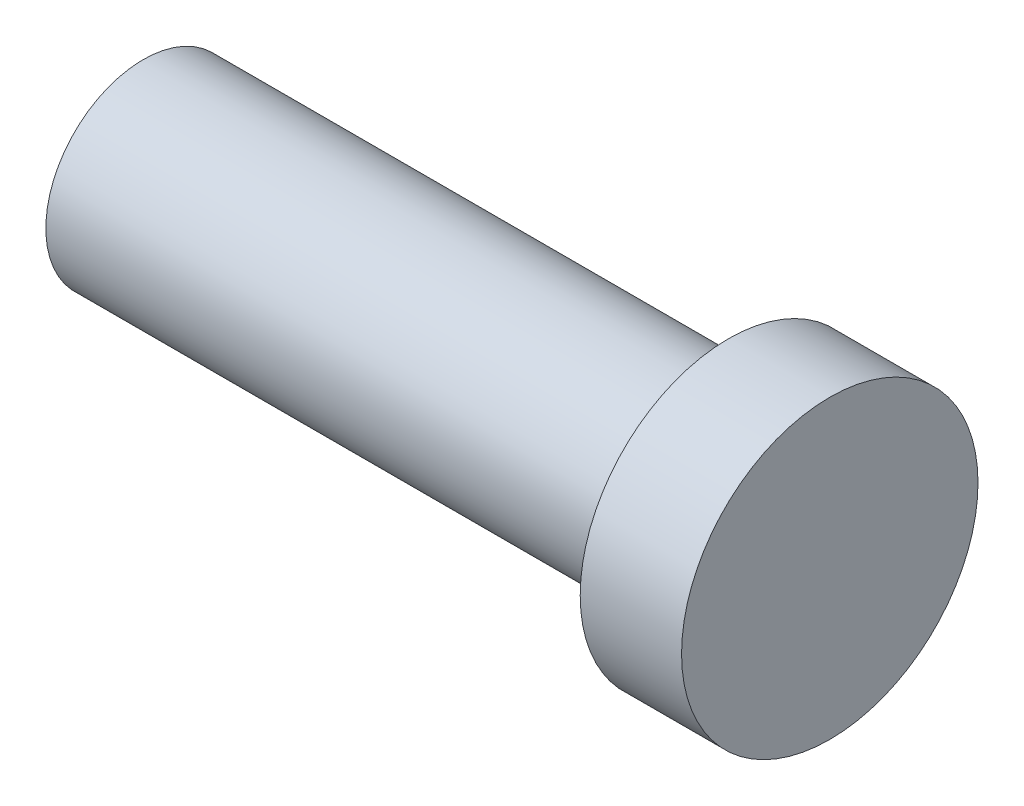
ISO-10303-21;
HEADER;
FILE_DESCRIPTION(('STEP AP214'),'2;1');
FILE_NAME('part.step','',(''),(''),'','','');
FILE_SCHEMA(('AUTOMOTIVE_DESIGN { 1 0 10303 214 1 1 1 1 }'));
ENDSEC;
DATA;
#1=APPLICATION_CONTEXT('core data for automotive mechanical design processes');
#2=APPLICATION_PROTOCOL_DEFINITION('international standard','automotive_design',2000,#1);
#3=PRODUCT_CONTEXT('',#1,'mechanical');
#4=PRODUCT('Part','Part','',(#3));
#5=PRODUCT_RELATED_PRODUCT_CATEGORY('part','',(#4));
#6=PRODUCT_DEFINITION_FORMATION('','',#4);
#7=PRODUCT_DEFINITION_CONTEXT('part definition',#1,'design');
#8=PRODUCT_DEFINITION('design','',#6,#7);
#9=PRODUCT_DEFINITION_SHAPE('','',#8);
#10=(LENGTH_UNIT() NAMED_UNIT(*) SI_UNIT(.MILLI.,.METRE.));
#11=(NAMED_UNIT(*) PLANE_ANGLE_UNIT() SI_UNIT($,.RADIAN.));
#12=(NAMED_UNIT(*) SI_UNIT($,.STERADIAN.) SOLID_ANGLE_UNIT());
#13=UNCERTAINTY_MEASURE_WITH_UNIT(LENGTH_MEASURE(1.E-05),#10,'distance_accuracy_value','');
#14=(GEOMETRIC_REPRESENTATION_CONTEXT(3) GLOBAL_UNCERTAINTY_ASSIGNED_CONTEXT((#13)) GLOBAL_UNIT_ASSIGNED_CONTEXT((#10,
#11,#12)) REPRESENTATION_CONTEXT('',''));
#15=CARTESIAN_POINT('',(0.,0.,0.));
#16=DIRECTION('',(0.,0.,1.));
#17=DIRECTION('',(1.,0.,0.));
#18=AXIS2_PLACEMENT_3D('',#15,#16,#17);
#19=CARTESIAN_POINT('',(-3.3,0.,0.));
#20=DIRECTION('',(1.,0.,0.));
#21=DIRECTION('',(0.,0.,-1.));
#22=AXIS2_PLACEMENT_3D('',#19,#20,#21);
#23=CYLINDRICAL_SURFACE('',#22,4.826);
#24=CARTESIAN_POINT('',(-3.3,0.,0.));
#25=DIRECTION('',(1.,0.,0.));
#26=DIRECTION('',(0.,0.,-1.));
#27=AXIS2_PLACEMENT_3D('',#24,#25,#26);
#28=CIRCLE('',#27,4.826);
#29=CARTESIAN_POINT('',(-3.3,0.,-4.826));
#30=VERTEX_POINT('',#29);
#31=EDGE_CURVE('E43',#30,#30,#28,.T.);
#32=ORIENTED_EDGE('',*,*,#31,.T.);
#33=EDGE_LOOP('',(#32));
#34=FACE_BOUND('',#33,.T.);
#35=CARTESIAN_POINT('',(0.,0.,0.));
#36=DIRECTION('',(1.,0.,0.));
#37=DIRECTION('',(0.,0.,-1.));
#38=AXIS2_PLACEMENT_3D('',#35,#36,#37);
#39=CIRCLE('',#38,4.826);
#40=CARTESIAN_POINT('',(0.,0.,-4.826));
#41=VERTEX_POINT('',#40);
#42=EDGE_CURVE('E39',#41,#41,#39,.T.);
#43=ORIENTED_EDGE('',*,*,#42,.F.);
#44=EDGE_LOOP('',(#43));
#45=FACE_BOUND('',#44,.T.);
#46=ADVANCED_FACE('F36',(#34,#45),#23,.T.);
#47=CARTESIAN_POINT('',(-3.3,0.,0.));
#48=DIRECTION('',(1.,0.,0.));
#49=DIRECTION('',(0.,0.,-1.));
#50=AXIS2_PLACEMENT_3D('',#47,#48,#49);
#51=PLANE('',#50);
#52=CARTESIAN_POINT('',(-3.3,0.,0.));
#53=DIRECTION('',(-1.,0.,0.));
#54=DIRECTION('',(0.,0.,1.));
#55=AXIS2_PLACEMENT_3D('',#52,#53,#54);
#56=CIRCLE('',#55,3.175);
#57=CARTESIAN_POINT('',(-3.3,0.,-3.175));
#58=VERTEX_POINT('',#57);
#59=EDGE_CURVE('E10',#58,#58,#56,.T.);
#60=ORIENTED_EDGE('',*,*,#59,.F.);
#61=EDGE_LOOP('',(#60));
#62=FACE_BOUND('',#61,.T.);
#63=ORIENTED_EDGE('',*,*,#31,.F.);
#64=EDGE_LOOP('',(#63));
#65=FACE_BOUND('',#64,.T.);
#66=ADVANCED_FACE('F59',(#62,#65),#51,.F.);
#67=CARTESIAN_POINT('',(0.,0.,0.));
#68=DIRECTION('',(1.,0.,0.));
#69=DIRECTION('',(0.,0.,-1.));
#70=AXIS2_PLACEMENT_3D('',#67,#68,#69);
#71=PLANE('',#70);
#72=ORIENTED_EDGE('',*,*,#42,.T.);
#73=EDGE_LOOP('',(#72));
#74=FACE_BOUND('',#73,.T.);
#75=ADVANCED_FACE('F56',(#74),#71,.T.);
#76=CARTESIAN_POINT('',(-22.35,0.,0.));
#77=DIRECTION('',(1.,0.,0.));
#78=DIRECTION('',(0.,0.,-1.));
#79=AXIS2_PLACEMENT_3D('',#76,#77,#78);
#80=CYLINDRICAL_SURFACE('',#79,3.175);
#81=CARTESIAN_POINT('',(-22.35,0.,0.));
#82=DIRECTION('',(-1.,0.,0.));
#83=DIRECTION('',(0.,0.,1.));
#84=AXIS2_PLACEMENT_3D('',#81,#82,#83);
#85=CIRCLE('',#84,3.175);
#86=CARTESIAN_POINT('',(-22.35,0.,-3.175));
#87=VERTEX_POINT('',#86);
#88=EDGE_CURVE('E49',#87,#87,#85,.T.);
#89=CARTESIAN_POINT('',(-22.35,0.,-3.175));
#90=CARTESIAN_POINT('',(-22.1515625,0.,-3.175));
#91=CARTESIAN_POINT('',(-21.953125,0.,-3.175));
#92=CARTESIAN_POINT('',(-21.55625,0.,-3.175));
#93=CARTESIAN_POINT('',(-21.3578125,0.,-3.175));
#94=CARTESIAN_POINT('',(-20.9609375,0.,-3.175));
#95=CARTESIAN_POINT('',(-20.7625,0.,-3.175));
#96=CARTESIAN_POINT('',(-20.365625,0.,-3.175));
#97=CARTESIAN_POINT('',(-20.1671875,0.,-3.175));
#98=CARTESIAN_POINT('',(-19.7703125,0.,-3.175));
#99=CARTESIAN_POINT('',(-19.571875,0.,-3.175));
#100=CARTESIAN_POINT('',(-19.175,0.,-3.175));
#101=CARTESIAN_POINT('',(-18.9765625,0.,-3.175));
#102=CARTESIAN_POINT('',(-18.5796875,0.,-3.175));
#103=CARTESIAN_POINT('',(-18.38125,0.,-3.175));
#104=CARTESIAN_POINT('',(-17.984375,0.,-3.175));
#105=CARTESIAN_POINT('',(-17.7859375,0.,-3.175));
#106=CARTESIAN_POINT('',(-17.3890625,0.,-3.175));
#107=CARTESIAN_POINT('',(-17.190625,0.,-3.175));
#108=CARTESIAN_POINT('',(-16.79375,0.,-3.175));
#109=CARTESIAN_POINT('',(-16.5953125,0.,-3.175));
#110=CARTESIAN_POINT('',(-16.1984375,0.,-3.175));
#111=CARTESIAN_POINT('',(-16.,0.,-3.175));
#112=CARTESIAN_POINT('',(-15.603125,0.,-3.175));
#113=CARTESIAN_POINT('',(-15.4046875,0.,-3.175));
#114=CARTESIAN_POINT('',(-15.0078125,0.,-3.175));
#115=CARTESIAN_POINT('',(-14.809375,0.,-3.175));
#116=CARTESIAN_POINT('',(-14.4125,0.,-3.175));
#117=CARTESIAN_POINT('',(-14.2140625,0.,-3.175));
#118=CARTESIAN_POINT('',(-13.8171875,0.,-3.175));
#119=CARTESIAN_POINT('',(-13.61875,0.,-3.175));
#120=CARTESIAN_POINT('',(-13.221875,0.,-3.175));
#121=CARTESIAN_POINT('',(-13.0234375,0.,-3.175));
#122=CARTESIAN_POINT('',(-12.6265625,0.,-3.175));
#123=CARTESIAN_POINT('',(-12.428125,0.,-3.175));
#124=CARTESIAN_POINT('',(-12.03125,0.,-3.175));
#125=CARTESIAN_POINT('',(-11.8328125,0.,-3.175));
#126=CARTESIAN_POINT('',(-11.4359375,0.,-3.175));
#127=CARTESIAN_POINT('',(-11.2375,0.,-3.175));
#128=CARTESIAN_POINT('',(-10.840625,0.,-3.175));
#129=CARTESIAN_POINT('',(-10.6421875,0.,-3.175));
#130=CARTESIAN_POINT('',(-10.2453125,0.,-3.175));
#131=CARTESIAN_POINT('',(-10.046875,0.,-3.175));
#132=CARTESIAN_POINT('',(-9.65,0.,-3.175));
#133=CARTESIAN_POINT('',(-9.4515625,0.,-3.175));
#134=CARTESIAN_POINT('',(-9.0546875,0.,-3.175));
#135=CARTESIAN_POINT('',(-8.85625,0.,-3.175));
#136=CARTESIAN_POINT('',(-8.459375,0.,-3.175));
#137=CARTESIAN_POINT('',(-8.2609375,0.,-3.175));
#138=CARTESIAN_POINT('',(-7.8640625,0.,-3.175));
#139=CARTESIAN_POINT('',(-7.665625,0.,-3.175));
#140=CARTESIAN_POINT('',(-7.26875,0.,-3.175));
#141=CARTESIAN_POINT('',(-7.0703125,0.,-3.175));
#142=CARTESIAN_POINT('',(-6.6734375,0.,-3.175));
#143=CARTESIAN_POINT('',(-6.475,0.,-3.175));
#144=CARTESIAN_POINT('',(-6.078125,0.,-3.175));
#145=CARTESIAN_POINT('',(-5.8796875,0.,-3.175));
#146=CARTESIAN_POINT('',(-5.4828125,0.,-3.175));
#147=CARTESIAN_POINT('',(-5.284375,0.,-3.175));
#148=CARTESIAN_POINT('',(-4.8875,0.,-3.175));
#149=CARTESIAN_POINT('',(-4.6890625,0.,-3.175));
#150=CARTESIAN_POINT('',(-4.2921875,0.,-3.175));
#151=CARTESIAN_POINT('',(-4.09375,0.,-3.175));
#152=CARTESIAN_POINT('',(-3.696875,0.,-3.175));
#153=CARTESIAN_POINT('',(-3.4984375,0.,-3.175));
#154=CARTESIAN_POINT('',(-3.3,0.,-3.175));
#155=B_SPLINE_CURVE_WITH_KNOTS('',3,(#89,#90,#91,#92,#93,#94,#95,#96,#97,#98,#99,#100,#101,#102,
#103,#104,#105,#106,#107,#108,#109,#110,#111,#112,#113,#114,#115,#116,#117,#118,#119,#120,#121,
#122,#123,#124,#125,#126,#127,#128,#129,#130,#131,#132,#133,#134,#135,#136,#137,#138,#139,#140,
#141,#142,#143,#144,#145,#146,#147,#148,#149,#150,#151,#152,#153,#154),.UNSPECIFIED.,.F.,.F.,(4,
2,2,2,2,2,2,2,2,2,2,2,2,2,2,2,2,2,2,2,2,2,2,2,2,2,2,2,2,2,2,2,4),(0.,0.595312499999997,1.190625,
1.7859375,2.38125,2.9765625,3.571875,4.1671875,4.7625,5.3578125,5.953125,6.5484375,7.14375,
7.7390625,8.334375,8.9296875,9.525,10.1203125,10.715625,11.3109375,11.90625,12.5015625,
13.096875,13.6921875,14.2875,14.8828125,15.478125,16.0734375,16.66875,17.2640625,17.859375,
18.4546875,19.05),.UNSPECIFIED.);
#156=EDGE_CURVE('BSEAM71',#87,#58,#155,.T.);
#157=ORIENTED_EDGE('',*,*,#88,.F.);
#158=ORIENTED_EDGE('',*,*,#59,.T.);
#159=ORIENTED_EDGE('',*,*,#156,.T.);
#160=ORIENTED_EDGE('',*,*,#156,.F.);
#161=EDGE_LOOP('',(#157,#159,#158,#160));
#162=FACE_BOUND('',#161,.T.);
#163=ADVANCED_FACE('F71',(#162),#80,.T.);
#164=CARTESIAN_POINT('',(-22.35,0.,0.));
#165=DIRECTION('',(-1.,0.,0.));
#166=DIRECTION('',(0.,0.,1.));
#167=AXIS2_PLACEMENT_3D('',#164,#165,#166);
#168=PLANE('',#167);
#169=ORIENTED_EDGE('',*,*,#88,.T.);
#170=EDGE_LOOP('',(#169));
#171=FACE_BOUND('',#170,.T.);
#172=ADVANCED_FACE('F75',(#171),#168,.T.);
#173=CLOSED_SHELL('',(#46,#66,#75,#163,#172));
#174=MANIFOLD_SOLID_BREP('B2',#173);
#175=ADVANCED_BREP_SHAPE_REPRESENTATION('',(#18,#174),#14);
#176=SHAPE_DEFINITION_REPRESENTATION(#9,#175);
ENDSEC;
END-ISO-10303-21;
